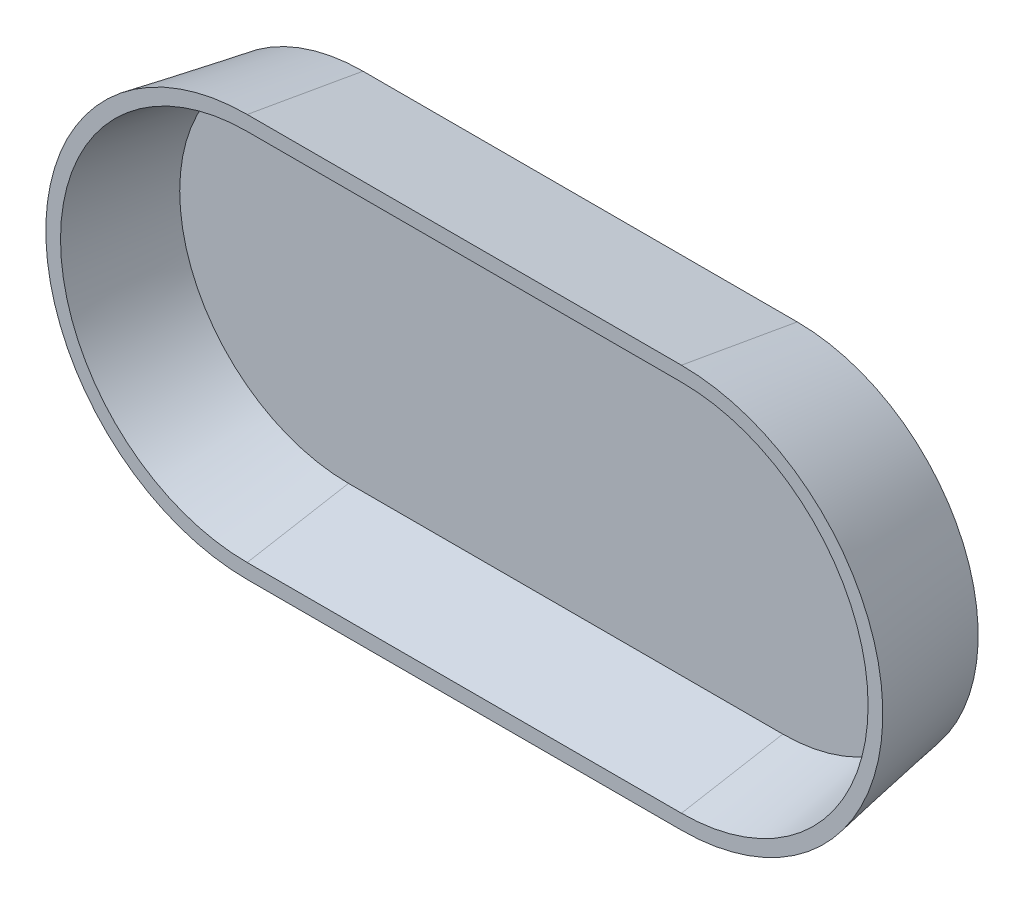
ISO-10303-21;
HEADER;
FILE_DESCRIPTION(('STEP AP214'),'2;1');
FILE_NAME('part.step','',(''),(''),'','','');
FILE_SCHEMA(('AUTOMOTIVE_DESIGN { 1 0 10303 214 1 1 1 1 }'));
ENDSEC;
DATA;
#1=APPLICATION_CONTEXT('core data for automotive mechanical design processes');
#2=APPLICATION_PROTOCOL_DEFINITION('international standard','automotive_design',2000,#1);
#3=PRODUCT_CONTEXT('',#1,'mechanical');
#4=PRODUCT('Part','Part','',(#3));
#5=PRODUCT_RELATED_PRODUCT_CATEGORY('part','',(#4));
#6=PRODUCT_DEFINITION_FORMATION('','',#4);
#7=PRODUCT_DEFINITION_CONTEXT('part definition',#1,'design');
#8=PRODUCT_DEFINITION('design','',#6,#7);
#9=PRODUCT_DEFINITION_SHAPE('','',#8);
#10=(LENGTH_UNIT() NAMED_UNIT(*) SI_UNIT(.MILLI.,.METRE.));
#11=(NAMED_UNIT(*) PLANE_ANGLE_UNIT() SI_UNIT($,.RADIAN.));
#12=(NAMED_UNIT(*) SI_UNIT($,.STERADIAN.) SOLID_ANGLE_UNIT());
#13=UNCERTAINTY_MEASURE_WITH_UNIT(LENGTH_MEASURE(1.E-05),#10,'distance_accuracy_value','');
#14=(GEOMETRIC_REPRESENTATION_CONTEXT(3) GLOBAL_UNCERTAINTY_ASSIGNED_CONTEXT((#13)) GLOBAL_UNIT_ASSIGNED_CONTEXT((#10,
#11,#12)) REPRESENTATION_CONTEXT('',''));
#15=CARTESIAN_POINT('',(0.,0.,0.));
#16=DIRECTION('',(0.,0.,1.));
#17=DIRECTION('',(1.,0.,0.));
#18=AXIS2_PLACEMENT_3D('',#15,#16,#17);
#19=CARTESIAN_POINT('',(0.,0.,0.));
#20=DIRECTION('',(0.,0.,1.));
#21=DIRECTION('',(1.,0.,0.));
#22=AXIS2_PLACEMENT_3D('',#19,#20,#21);
#23=CONICAL_SURFACE('',#22,12.5,0.174532925199433);
#24=CARTESIAN_POINT('',(0.,0.,0.));
#25=DIRECTION('',(0.,0.,1.));
#26=DIRECTION('',(1.,0.,0.));
#27=AXIS2_PLACEMENT_3D('',#24,#25,#26);
#28=CIRCLE('',#27,12.5);
#29=CARTESIAN_POINT('',(0.,-12.5,0.));
#30=VERTEX_POINT('',#29);
#31=CARTESIAN_POINT('',(0.,12.5,0.));
#32=VERTEX_POINT('',#31);
#33=EDGE_CURVE('E134',#30,#32,#28,.T.);
#34=ORIENTED_EDGE('',*,*,#33,.T.);
#35=DIRECTION('',(0.,0.17364817766693,0.984807753012208));
#36=VECTOR('',#35,1.);
#37=CARTESIAN_POINT('',(0.,12.5,0.));
#38=LINE('',#37,#36);
#39=CARTESIAN_POINT('',(0.,13.9106158456677,8.));
#40=VERTEX_POINT('',#39);
#41=EDGE_CURVE('E11',#40,#32,#38,.F.);
#42=ORIENTED_EDGE('',*,*,#41,.F.);
#43=CARTESIAN_POINT('',(0.,0.,8.));
#44=DIRECTION('',(0.,0.,1.));
#45=DIRECTION('',(1.,0.,0.));
#46=AXIS2_PLACEMENT_3D('',#43,#44,#45);
#47=CIRCLE('',#46,13.9106158456677);
#48=CARTESIAN_POINT('',(0.,-13.9106158456677,8.));
#49=VERTEX_POINT('',#48);
#50=EDGE_CURVE('E143',#49,#40,#47,.T.);
#51=ORIENTED_EDGE('',*,*,#50,.F.);
#52=DIRECTION('',(0.,-0.17364817766693,0.984807753012208));
#53=VECTOR('',#52,1.);
#54=CARTESIAN_POINT('',(0.,-12.5,0.));
#55=LINE('',#54,#53);
#56=EDGE_CURVE('E149',#49,#30,#55,.F.);
#57=ORIENTED_EDGE('',*,*,#56,.T.);
#58=EDGE_LOOP('',(#34,#42,#51,#57));
#59=FACE_BOUND('',#58,.T.);
#60=ADVANCED_FACE('F33',(#59),#23,.T.);
#61=CARTESIAN_POINT('',(0.,12.5,0.));
#62=DIRECTION('',(0.,0.984807753012208,-0.17364817766693));
#63=DIRECTION('',(0.,0.17364817766693,0.984807753012208));
#64=AXIS2_PLACEMENT_3D('',#61,#62,#63);
#65=PLANE('',#64);
#66=DIRECTION('',(-1.,0.,0.));
#67=VECTOR('',#66,1.);
#68=CARTESIAN_POINT('',(0.,12.5,0.));
#69=LINE('',#68,#67);
#70=CARTESIAN_POINT('',(-30.,12.5,0.));
#71=VERTEX_POINT('',#70);
#72=EDGE_CURVE('E137',#32,#71,#69,.T.);
#73=ORIENTED_EDGE('',*,*,#72,.T.);
#74=DIRECTION('',(0.,0.17364817766693,0.984807753012208));
#75=VECTOR('',#74,1.);
#76=CARTESIAN_POINT('',(-30.,12.5,0.));
#77=LINE('',#76,#75);
#78=CARTESIAN_POINT('',(-30.,13.9106158456677,8.));
#79=VERTEX_POINT('',#78);
#80=EDGE_CURVE('E37',#79,#71,#77,.F.);
#81=ORIENTED_EDGE('',*,*,#80,.F.);
#82=DIRECTION('',(1.,0.,0.));
#83=VECTOR('',#82,1.);
#84=CARTESIAN_POINT('',(0.,13.9106158456677,8.));
#85=LINE('',#84,#83);
#86=EDGE_CURVE('E145',#40,#79,#85,.F.);
#87=ORIENTED_EDGE('',*,*,#86,.F.);
#88=ORIENTED_EDGE('',*,*,#41,.T.);
#89=EDGE_LOOP('',(#73,#81,#87,#88));
#90=FACE_BOUND('',#89,.T.);
#91=ADVANCED_FACE('F35',(#90),#65,.T.);
#92=CARTESIAN_POINT('',(-30.,0.,0.));
#93=DIRECTION('',(0.,0.,1.));
#94=DIRECTION('',(1.,0.,0.));
#95=AXIS2_PLACEMENT_3D('',#92,#93,#94);
#96=CONICAL_SURFACE('',#95,12.5,0.174532925199433);
#97=CARTESIAN_POINT('',(-30.,0.,0.));
#98=DIRECTION('',(0.,0.,1.));
#99=DIRECTION('',(1.,0.,0.));
#100=AXIS2_PLACEMENT_3D('',#97,#98,#99);
#101=CIRCLE('',#100,12.5);
#102=CARTESIAN_POINT('',(-30.,-12.5,0.));
#103=VERTEX_POINT('',#102);
#104=EDGE_CURVE('E139',#71,#103,#101,.T.);
#105=ORIENTED_EDGE('',*,*,#104,.T.);
#106=DIRECTION('',(0.,-0.17364817766693,0.984807753012208));
#107=VECTOR('',#106,1.);
#108=CARTESIAN_POINT('',(-30.,-12.5,0.));
#109=LINE('',#108,#107);
#110=CARTESIAN_POINT('',(-30.,-13.9106158456677,8.));
#111=VERTEX_POINT('',#110);
#112=EDGE_CURVE('E152',#111,#103,#109,.F.);
#113=ORIENTED_EDGE('',*,*,#112,.F.);
#114=CARTESIAN_POINT('',(-30.,0.,8.));
#115=DIRECTION('',(0.,0.,1.));
#116=DIRECTION('',(1.,0.,0.));
#117=AXIS2_PLACEMENT_3D('',#114,#115,#116);
#118=CIRCLE('',#117,13.9106158456677);
#119=EDGE_CURVE('E147',#79,#111,#118,.T.);
#120=ORIENTED_EDGE('',*,*,#119,.F.);
#121=ORIENTED_EDGE('',*,*,#80,.T.);
#122=EDGE_LOOP('',(#105,#113,#120,#121));
#123=FACE_BOUND('',#122,.T.);
#124=ADVANCED_FACE('F162',(#123),#96,.T.);
#125=CARTESIAN_POINT('',(0.,-12.5,0.));
#126=DIRECTION('',(0.,-0.984807753012208,-0.17364817766693));
#127=DIRECTION('',(0.,0.17364817766693,-0.984807753012208));
#128=AXIS2_PLACEMENT_3D('',#125,#126,#127);
#129=PLANE('',#128);
#130=DIRECTION('',(1.,0.,0.));
#131=VECTOR('',#130,1.);
#132=CARTESIAN_POINT('',(0.,-12.5,0.));
#133=LINE('',#132,#131);
#134=EDGE_CURVE('E141',#103,#30,#133,.T.);
#135=ORIENTED_EDGE('',*,*,#134,.T.);
#136=ORIENTED_EDGE('',*,*,#56,.F.);
#137=DIRECTION('',(-1.,0.,0.));
#138=VECTOR('',#137,1.);
#139=CARTESIAN_POINT('',(0.,-13.9106158456677,8.));
#140=LINE('',#139,#138);
#141=EDGE_CURVE('E57',#111,#49,#140,.F.);
#142=ORIENTED_EDGE('',*,*,#141,.F.);
#143=ORIENTED_EDGE('',*,*,#112,.T.);
#144=EDGE_LOOP('',(#135,#136,#142,#143));
#145=FACE_BOUND('',#144,.T.);
#146=ADVANCED_FACE('F167',(#145),#129,.T.);
#147=CARTESIAN_POINT('',(0.,0.,8.));
#148=DIRECTION('',(0.,0.,1.));
#149=DIRECTION('',(1.,0.,0.));
#150=AXIS2_PLACEMENT_3D('',#147,#148,#149);
#151=PLANE('',#150);
#152=CARTESIAN_POINT('',(0.,0.,8.));
#153=DIRECTION('',(0.,0.,1.));
#154=DIRECTION('',(1.,0.,0.));
#155=AXIS2_PLACEMENT_3D('',#152,#153,#154);
#156=CIRCLE('',#155,12.895189233782);
#157=CARTESIAN_POINT('',(0.,-12.895189233782,8.));
#158=VERTEX_POINT('',#157);
#159=CARTESIAN_POINT('',(0.,12.895189233782,8.));
#160=VERTEX_POINT('',#159);
#161=EDGE_CURVE('E123',#158,#160,#156,.T.);
#162=ORIENTED_EDGE('',*,*,#161,.F.);
#163=DIRECTION('',(-1.,0.,0.));
#164=VECTOR('',#163,1.);
#165=CARTESIAN_POINT('',(0.,-12.895189233782,8.));
#166=LINE('',#165,#164);
#167=CARTESIAN_POINT('',(-30.,-12.895189233782,8.));
#168=VERTEX_POINT('',#167);
#169=EDGE_CURVE('E132',#168,#158,#166,.F.);
#170=ORIENTED_EDGE('',*,*,#169,.F.);
#171=CARTESIAN_POINT('',(-30.,0.,8.));
#172=DIRECTION('',(0.,0.,1.));
#173=DIRECTION('',(1.,0.,0.));
#174=AXIS2_PLACEMENT_3D('',#171,#172,#173);
#175=CIRCLE('',#174,12.895189233782);
#176=CARTESIAN_POINT('',(-30.,12.895189233782,8.));
#177=VERTEX_POINT('',#176);
#178=EDGE_CURVE('E130',#177,#168,#175,.T.);
#179=ORIENTED_EDGE('',*,*,#178,.F.);
#180=DIRECTION('',(1.,0.,0.));
#181=VECTOR('',#180,1.);
#182=CARTESIAN_POINT('',(0.,12.895189233782,8.));
#183=LINE('',#182,#181);
#184=EDGE_CURVE('E115',#160,#177,#183,.F.);
#185=ORIENTED_EDGE('',*,*,#184,.F.);
#186=EDGE_LOOP('',(#162,#170,#179,#185));
#187=FACE_BOUND('',#186,.T.);
#188=ORIENTED_EDGE('',*,*,#50,.T.);
#189=ORIENTED_EDGE('',*,*,#86,.T.);
#190=ORIENTED_EDGE('',*,*,#119,.T.);
#191=ORIENTED_EDGE('',*,*,#141,.T.);
#192=EDGE_LOOP('',(#188,#189,#190,#191));
#193=FACE_BOUND('',#192,.T.);
#194=ADVANCED_FACE('F171',(#187,#193),#151,.T.);
#195=CARTESIAN_POINT('',(0.,0.,0.));
#196=DIRECTION('',(0.,0.,1.));
#197=DIRECTION('',(1.,0.,0.));
#198=AXIS2_PLACEMENT_3D('',#195,#196,#197);
#199=PLANE('',#198);
#200=ORIENTED_EDGE('',*,*,#33,.F.);
#201=ORIENTED_EDGE('',*,*,#134,.F.);
#202=ORIENTED_EDGE('',*,*,#104,.F.);
#203=ORIENTED_EDGE('',*,*,#72,.F.);
#204=EDGE_LOOP('',(#200,#201,#202,#203));
#205=FACE_BOUND('',#204,.T.);
#206=ADVANCED_FACE('F166',(#205),#199,.F.);
#207=CARTESIAN_POINT('',(0.,0.,0.17364817766693));
#208=DIRECTION('',(0.,0.,1.));
#209=DIRECTION('',(1.,0.,0.));
#210=AXIS2_PLACEMENT_3D('',#207,#208,#209);
#211=CONICAL_SURFACE('',#210,11.5151922469878,0.174532925199433);
#212=CARTESIAN_POINT('',(0.,0.,1.));
#213=DIRECTION('',(0.,0.,1.));
#214=DIRECTION('',(1.,0.,0.));
#215=AXIS2_PLACEMENT_3D('',#212,#213,#214);
#216=CIRCLE('',#215,11.6609003688227);
#217=CARTESIAN_POINT('',(0.,-11.6609003688227,1.));
#218=VERTEX_POINT('',#217);
#219=CARTESIAN_POINT('',(0.,11.6609003688227,1.));
#220=VERTEX_POINT('',#219);
#221=EDGE_CURVE('E106',#218,#220,#216,.T.);
#222=ORIENTED_EDGE('',*,*,#221,.F.);
#223=DIRECTION('',(0.,-0.17364817766693,0.984807753012208));
#224=VECTOR('',#223,1.);
#225=CARTESIAN_POINT('',(0.,-11.5151922469878,0.17364817766693));
#226=LINE('',#225,#224);
#227=EDGE_CURVE('E126',#158,#218,#226,.F.);
#228=ORIENTED_EDGE('',*,*,#227,.F.);
#229=ORIENTED_EDGE('',*,*,#161,.T.);
#230=DIRECTION('',(0.,0.17364817766693,0.984807753012208));
#231=VECTOR('',#230,1.);
#232=CARTESIAN_POINT('',(0.,11.5151922469878,0.17364817766693));
#233=LINE('',#232,#231);
#234=EDGE_CURVE('E118',#160,#220,#233,.F.);
#235=ORIENTED_EDGE('',*,*,#234,.T.);
#236=EDGE_LOOP('',(#222,#228,#229,#235));
#237=FACE_BOUND('',#236,.T.);
#238=ADVANCED_FACE('F191',(#237),#211,.F.);
#239=CARTESIAN_POINT('',(0.,11.5151922469878,0.17364817766693));
#240=DIRECTION('',(0.,0.984807753012208,-0.17364817766693));
#241=DIRECTION('',(0.,0.17364817766693,0.984807753012208));
#242=AXIS2_PLACEMENT_3D('',#239,#240,#241);
#243=PLANE('',#242);
#244=DIRECTION('',(1.,0.,0.));
#245=VECTOR('',#244,1.);
#246=CARTESIAN_POINT('',(0.,11.6609003688227,1.));
#247=LINE('',#246,#245);
#248=CARTESIAN_POINT('',(-30.,11.6609003688227,1.));
#249=VERTEX_POINT('',#248);
#250=EDGE_CURVE('E100',#220,#249,#247,.F.);
#251=ORIENTED_EDGE('',*,*,#250,.F.);
#252=ORIENTED_EDGE('',*,*,#234,.F.);
#253=ORIENTED_EDGE('',*,*,#184,.T.);
#254=DIRECTION('',(0.,0.17364817766693,0.984807753012208));
#255=VECTOR('',#254,1.);
#256=CARTESIAN_POINT('',(-30.,11.5151922469878,0.17364817766693));
#257=LINE('',#256,#255);
#258=EDGE_CURVE('E112',#177,#249,#257,.F.);
#259=ORIENTED_EDGE('',*,*,#258,.T.);
#260=EDGE_LOOP('',(#251,#252,#253,#259));
#261=FACE_BOUND('',#260,.T.);
#262=ADVANCED_FACE('F113',(#261),#243,.F.);
#263=CARTESIAN_POINT('',(-30.,0.,0.17364817766693));
#264=DIRECTION('',(0.,0.,1.));
#265=DIRECTION('',(1.,0.,0.));
#266=AXIS2_PLACEMENT_3D('',#263,#264,#265);
#267=CONICAL_SURFACE('',#266,11.5151922469878,0.174532925199433);
#268=CARTESIAN_POINT('',(-30.,0.,1.));
#269=DIRECTION('',(0.,0.,1.));
#270=DIRECTION('',(1.,0.,0.));
#271=AXIS2_PLACEMENT_3D('',#268,#269,#270);
#272=CIRCLE('',#271,11.6609003688227);
#273=CARTESIAN_POINT('',(-30.,-11.6609003688227,1.));
#274=VERTEX_POINT('',#273);
#275=EDGE_CURVE('E104',#249,#274,#272,.T.);
#276=ORIENTED_EDGE('',*,*,#275,.F.);
#277=ORIENTED_EDGE('',*,*,#258,.F.);
#278=ORIENTED_EDGE('',*,*,#178,.T.);
#279=DIRECTION('',(0.,0.17364817766693,-0.984807753012208));
#280=VECTOR('',#279,1.);
#281=CARTESIAN_POINT('',(-30.,-11.5151922469878,0.17364817766693));
#282=LINE('',#281,#280);
#283=EDGE_CURVE('E49',#168,#274,#282,.T.);
#284=ORIENTED_EDGE('',*,*,#283,.T.);
#285=EDGE_LOOP('',(#276,#277,#278,#284));
#286=FACE_BOUND('',#285,.T.);
#287=ADVANCED_FACE('F120',(#286),#267,.F.);
#288=CARTESIAN_POINT('',(0.,-11.5151922469878,0.17364817766693));
#289=DIRECTION('',(0.,-0.984807753012208,-0.17364817766693));
#290=DIRECTION('',(0.,0.17364817766693,-0.984807753012208));
#291=AXIS2_PLACEMENT_3D('',#288,#289,#290);
#292=PLANE('',#291);
#293=DIRECTION('',(-1.,0.,0.));
#294=VECTOR('',#293,1.);
#295=CARTESIAN_POINT('',(0.,-11.6609003688227,1.));
#296=LINE('',#295,#294);
#297=EDGE_CURVE('E121',#274,#218,#296,.F.);
#298=ORIENTED_EDGE('',*,*,#297,.F.);
#299=ORIENTED_EDGE('',*,*,#283,.F.);
#300=ORIENTED_EDGE('',*,*,#169,.T.);
#301=ORIENTED_EDGE('',*,*,#227,.T.);
#302=EDGE_LOOP('',(#298,#299,#300,#301));
#303=FACE_BOUND('',#302,.T.);
#304=ADVANCED_FACE('F196',(#303),#292,.F.);
#305=CARTESIAN_POINT('',(0.,0.,1.));
#306=DIRECTION('',(0.,0.,1.));
#307=DIRECTION('',(1.,0.,0.));
#308=AXIS2_PLACEMENT_3D('',#305,#306,#307);
#309=PLANE('',#308);
#310=ORIENTED_EDGE('',*,*,#221,.T.);
#311=ORIENTED_EDGE('',*,*,#250,.T.);
#312=ORIENTED_EDGE('',*,*,#275,.T.);
#313=ORIENTED_EDGE('',*,*,#297,.T.);
#314=EDGE_LOOP('',(#310,#311,#312,#313));
#315=FACE_BOUND('',#314,.T.);
#316=ADVANCED_FACE('F102',(#315),#309,.T.);
#317=CLOSED_SHELL('',(#60,#91,#124,#146,#194,#206,#238,#262,#287,#304,#316));
#318=MANIFOLD_SOLID_BREP('B2',#317);
#319=ADVANCED_BREP_SHAPE_REPRESENTATION('',(#18,#318),#14);
#320=SHAPE_DEFINITION_REPRESENTATION(#9,#319);
ENDSEC;
END-ISO-10303-21;
